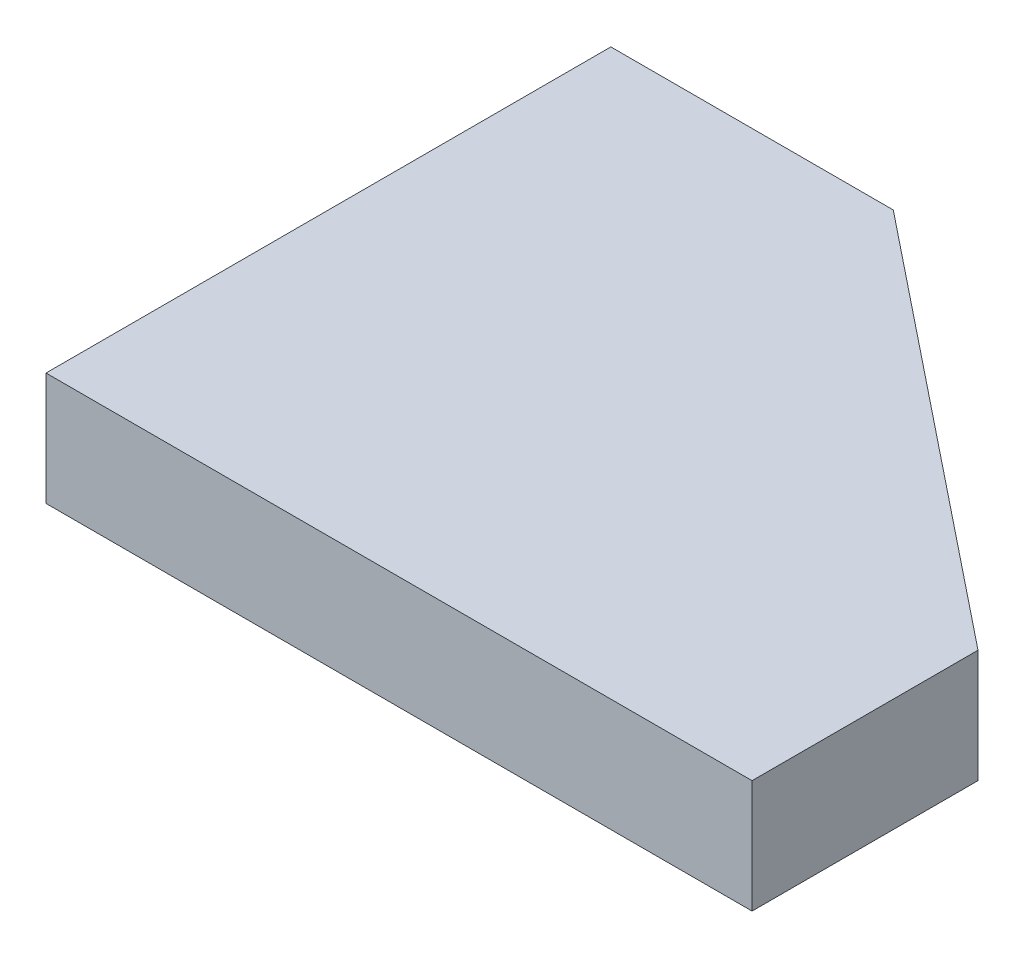
ISO-10303-21;
HEADER;
FILE_DESCRIPTION(('STEP AP214'),'2;1');
FILE_NAME('part.step','',(''),(''),'','','');
FILE_SCHEMA(('AUTOMOTIVE_DESIGN { 1 0 10303 214 1 1 1 1 }'));
ENDSEC;
DATA;
#1=APPLICATION_CONTEXT('core data for automotive mechanical design processes');
#2=APPLICATION_PROTOCOL_DEFINITION('international standard','automotive_design',2000,#1);
#3=PRODUCT_CONTEXT('',#1,'mechanical');
#4=PRODUCT('Part','Part','',(#3));
#5=PRODUCT_RELATED_PRODUCT_CATEGORY('part','',(#4));
#6=PRODUCT_DEFINITION_FORMATION('','',#4);
#7=PRODUCT_DEFINITION_CONTEXT('part definition',#1,'design');
#8=PRODUCT_DEFINITION('design','',#6,#7);
#9=PRODUCT_DEFINITION_SHAPE('','',#8);
#10=(LENGTH_UNIT() NAMED_UNIT(*) SI_UNIT(.MILLI.,.METRE.));
#11=(NAMED_UNIT(*) PLANE_ANGLE_UNIT() SI_UNIT($,.RADIAN.));
#12=(NAMED_UNIT(*) SI_UNIT($,.STERADIAN.) SOLID_ANGLE_UNIT());
#13=UNCERTAINTY_MEASURE_WITH_UNIT(LENGTH_MEASURE(1.E-05),#10,'distance_accuracy_value','');
#14=(GEOMETRIC_REPRESENTATION_CONTEXT(3) GLOBAL_UNCERTAINTY_ASSIGNED_CONTEXT((#13)) GLOBAL_UNIT_ASSIGNED_CONTEXT((#10,
#11,#12)) REPRESENTATION_CONTEXT('',''));
#15=CARTESIAN_POINT('',(0.,0.,0.));
#16=DIRECTION('',(0.,0.,1.));
#17=DIRECTION('',(1.,0.,0.));
#18=AXIS2_PLACEMENT_3D('',#15,#16,#17);
#19=CARTESIAN_POINT('',(0.,4.,0.));
#20=DIRECTION('',(0.,0.,-1.));
#21=DIRECTION('',(-1.,0.,0.));
#22=AXIS2_PLACEMENT_3D('',#19,#20,#21);
#23=PLANE('',#22);
#24=DIRECTION('',(1.,0.,0.));
#25=VECTOR('',#24,1.);
#26=CARTESIAN_POINT('',(0.,0.,0.));
#27=LINE('',#26,#25);
#28=CARTESIAN_POINT('',(0.,0.,0.));
#29=VERTEX_POINT('',#28);
#30=CARTESIAN_POINT('',(24.9999999874367,0.,0.));
#31=VERTEX_POINT('',#30);
#32=EDGE_CURVE('E105',#29,#31,#27,.T.);
#33=ORIENTED_EDGE('',*,*,#32,.T.);
#34=DIRECTION('',(0.,-1.,0.));
#35=VECTOR('',#34,1.);
#36=CARTESIAN_POINT('',(24.9999999874367,4.,0.));
#37=LINE('',#36,#35);
#38=CARTESIAN_POINT('',(24.9999999874367,4.,0.));
#39=VERTEX_POINT('',#38);
#40=EDGE_CURVE('E11',#39,#31,#37,.T.);
#41=ORIENTED_EDGE('',*,*,#40,.F.);
#42=DIRECTION('',(1.,0.,0.));
#43=VECTOR('',#42,1.);
#44=CARTESIAN_POINT('',(0.,4.,0.));
#45=LINE('',#44,#43);
#46=CARTESIAN_POINT('',(0.,4.,0.));
#47=VERTEX_POINT('',#46);
#48=EDGE_CURVE('E113',#47,#39,#45,.T.);
#49=ORIENTED_EDGE('',*,*,#48,.F.);
#50=DIRECTION('',(0.,-1.,0.));
#51=VECTOR('',#50,1.);
#52=CARTESIAN_POINT('',(0.,4.,0.));
#53=LINE('',#52,#51);
#54=EDGE_CURVE('E101',#47,#29,#53,.T.);
#55=ORIENTED_EDGE('',*,*,#54,.T.);
#56=EDGE_LOOP('',(#33,#41,#49,#55));
#57=FACE_BOUND('',#56,.T.);
#58=ADVANCED_FACE('F31',(#57),#23,.F.);
#59=CARTESIAN_POINT('',(24.9999999874367,4.,0.));
#60=DIRECTION('',(-1.,0.,0.));
#61=DIRECTION('',(0.,0.,1.));
#62=AXIS2_PLACEMENT_3D('',#59,#60,#61);
#63=PLANE('',#62);
#64=DIRECTION('',(0.,0.,-1.));
#65=VECTOR('',#64,1.);
#66=CARTESIAN_POINT('',(24.9999999874367,0.,0.));
#67=LINE('',#66,#65);
#68=CARTESIAN_POINT('',(24.9999999874367,0.,-8.00000000000001));
#69=VERTEX_POINT('',#68);
#70=EDGE_CURVE('E108',#31,#69,#67,.T.);
#71=ORIENTED_EDGE('',*,*,#70,.T.);
#72=DIRECTION('',(0.,-1.,0.));
#73=VECTOR('',#72,1.);
#74=CARTESIAN_POINT('',(24.9999999874367,4.,-8.00000000000001));
#75=LINE('',#74,#73);
#76=CARTESIAN_POINT('',(24.9999999874367,4.,-8.00000000000001));
#77=VERTEX_POINT('',#76);
#78=EDGE_CURVE('E39',#77,#69,#75,.T.);
#79=ORIENTED_EDGE('',*,*,#78,.F.);
#80=DIRECTION('',(0.,0.,-1.));
#81=VECTOR('',#80,1.);
#82=CARTESIAN_POINT('',(24.9999999874367,4.,0.));
#83=LINE('',#82,#81);
#84=EDGE_CURVE('E81',#39,#77,#83,.T.);
#85=ORIENTED_EDGE('',*,*,#84,.F.);
#86=ORIENTED_EDGE('',*,*,#40,.T.);
#87=EDGE_LOOP('',(#71,#79,#85,#86));
#88=FACE_BOUND('',#87,.T.);
#89=ADVANCED_FACE('F132',(#88),#63,.F.);
#90=CARTESIAN_POINT('',(24.9999999874367,4.,-8.00000000000001));
#91=DIRECTION('',(-0.624695028591271,0.,0.780868824613552));
#92=DIRECTION('',(0.780868824613553,0.,0.624695028591271));
#93=AXIS2_PLACEMENT_3D('',#90,#91,#92);
#94=PLANE('',#93);
#95=DIRECTION('',(-0.780868824613552,0.,-0.624695028591271));
#96=VECTOR('',#95,1.);
#97=CARTESIAN_POINT('',(24.9999999874367,0.,-8.00000000000001));
#98=LINE('',#97,#96);
#99=CARTESIAN_POINT('',(9.99999924068264,0.,-20.));
#100=VERTEX_POINT('',#99);
#101=EDGE_CURVE('E96',#69,#100,#98,.T.);
#102=ORIENTED_EDGE('',*,*,#101,.T.);
#103=DIRECTION('',(0.,-1.,0.));
#104=VECTOR('',#103,1.);
#105=CARTESIAN_POINT('',(9.99999924068264,4.,-20.));
#106=LINE('',#105,#104);
#107=CARTESIAN_POINT('',(9.99999924068264,4.,-20.));
#108=VERTEX_POINT('',#107);
#109=EDGE_CURVE('E93',#108,#100,#106,.T.);
#110=ORIENTED_EDGE('',*,*,#109,.F.);
#111=DIRECTION('',(-0.780868824613552,0.,-0.624695028591271));
#112=VECTOR('',#111,1.);
#113=CARTESIAN_POINT('',(24.9999999874367,4.,-8.00000000000001));
#114=LINE('',#113,#112);
#115=EDGE_CURVE('E85',#77,#108,#114,.T.);
#116=ORIENTED_EDGE('',*,*,#115,.F.);
#117=ORIENTED_EDGE('',*,*,#78,.T.);
#118=EDGE_LOOP('',(#102,#110,#116,#117));
#119=FACE_BOUND('',#118,.T.);
#120=ADVANCED_FACE('F94',(#119),#94,.F.);
#121=CARTESIAN_POINT('',(9.99999924068264,4.,-20.));
#122=DIRECTION('',(0.,0.,1.));
#123=DIRECTION('',(1.,0.,0.));
#124=AXIS2_PLACEMENT_3D('',#121,#122,#123);
#125=PLANE('',#124);
#126=DIRECTION('',(-1.,0.,0.));
#127=VECTOR('',#126,1.);
#128=CARTESIAN_POINT('',(9.99999924068264,0.,-20.));
#129=LINE('',#128,#127);
#130=CARTESIAN_POINT('',(0.,0.,-20.));
#131=VERTEX_POINT('',#130);
#132=EDGE_CURVE('E67',#100,#131,#129,.T.);
#133=ORIENTED_EDGE('',*,*,#132,.T.);
#134=DIRECTION('',(0.,-1.,0.));
#135=VECTOR('',#134,1.);
#136=CARTESIAN_POINT('',(0.,4.,-20.));
#137=LINE('',#136,#135);
#138=CARTESIAN_POINT('',(0.,4.,-20.));
#139=VERTEX_POINT('',#138);
#140=EDGE_CURVE('E97',#139,#131,#137,.T.);
#141=ORIENTED_EDGE('',*,*,#140,.F.);
#142=DIRECTION('',(-1.,0.,0.));
#143=VECTOR('',#142,1.);
#144=CARTESIAN_POINT('',(9.99999924068264,4.,-20.));
#145=LINE('',#144,#143);
#146=EDGE_CURVE('E89',#108,#139,#145,.T.);
#147=ORIENTED_EDGE('',*,*,#146,.F.);
#148=ORIENTED_EDGE('',*,*,#109,.T.);
#149=EDGE_LOOP('',(#133,#141,#147,#148));
#150=FACE_BOUND('',#149,.T.);
#151=ADVANCED_FACE('F99',(#150),#125,.F.);
#152=CARTESIAN_POINT('',(0.,4.,0.));
#153=DIRECTION('',(1.,0.,0.));
#154=DIRECTION('',(0.,0.,-1.));
#155=AXIS2_PLACEMENT_3D('',#152,#153,#154);
#156=PLANE('',#155);
#157=DIRECTION('',(0.,0.,1.));
#158=VECTOR('',#157,1.);
#159=CARTESIAN_POINT('',(0.,0.,0.));
#160=LINE('',#159,#158);
#161=EDGE_CURVE('E73',#131,#29,#160,.T.);
#162=ORIENTED_EDGE('',*,*,#161,.T.);
#163=ORIENTED_EDGE('',*,*,#54,.F.);
#164=DIRECTION('',(0.,0.,1.));
#165=VECTOR('',#164,1.);
#166=CARTESIAN_POINT('',(0.,4.,0.));
#167=LINE('',#166,#165);
#168=EDGE_CURVE('E47',#139,#47,#167,.T.);
#169=ORIENTED_EDGE('',*,*,#168,.F.);
#170=ORIENTED_EDGE('',*,*,#140,.T.);
#171=EDGE_LOOP('',(#162,#163,#169,#170));
#172=FACE_BOUND('',#171,.T.);
#173=ADVANCED_FACE('F121',(#172),#156,.F.);
#174=CARTESIAN_POINT('',(24.9999999874367,4.,0.));
#175=DIRECTION('',(0.,1.,0.));
#176=DIRECTION('',(0.,0.,1.));
#177=AXIS2_PLACEMENT_3D('',#174,#175,#176);
#178=PLANE('',#177);
#179=ORIENTED_EDGE('',*,*,#48,.T.);
#180=ORIENTED_EDGE('',*,*,#84,.T.);
#181=ORIENTED_EDGE('',*,*,#115,.T.);
#182=ORIENTED_EDGE('',*,*,#146,.T.);
#183=ORIENTED_EDGE('',*,*,#168,.T.);
#184=EDGE_LOOP('',(#179,#180,#181,#182,#183));
#185=FACE_BOUND('',#184,.T.);
#186=ADVANCED_FACE('F87',(#185),#178,.T.);
#187=CARTESIAN_POINT('',(24.9999999874367,0.,0.));
#188=DIRECTION('',(0.,1.,0.));
#189=DIRECTION('',(0.,0.,1.));
#190=AXIS2_PLACEMENT_3D('',#187,#188,#189);
#191=PLANE('',#190);
#192=ORIENTED_EDGE('',*,*,#32,.F.);
#193=ORIENTED_EDGE('',*,*,#161,.F.);
#194=ORIENTED_EDGE('',*,*,#132,.F.);
#195=ORIENTED_EDGE('',*,*,#101,.F.);
#196=ORIENTED_EDGE('',*,*,#70,.F.);
#197=EDGE_LOOP('',(#192,#193,#194,#195,#196));
#198=FACE_BOUND('',#197,.T.);
#199=ADVANCED_FACE('F117',(#198),#191,.F.);
#200=CLOSED_SHELL('',(#58,#89,#120,#151,#173,#186,#199));
#201=MANIFOLD_SOLID_BREP('B2',#200);
#202=ADVANCED_BREP_SHAPE_REPRESENTATION('',(#18,#201),#14);
#203=SHAPE_DEFINITION_REPRESENTATION(#9,#202);
ENDSEC;
END-ISO-10303-21;
